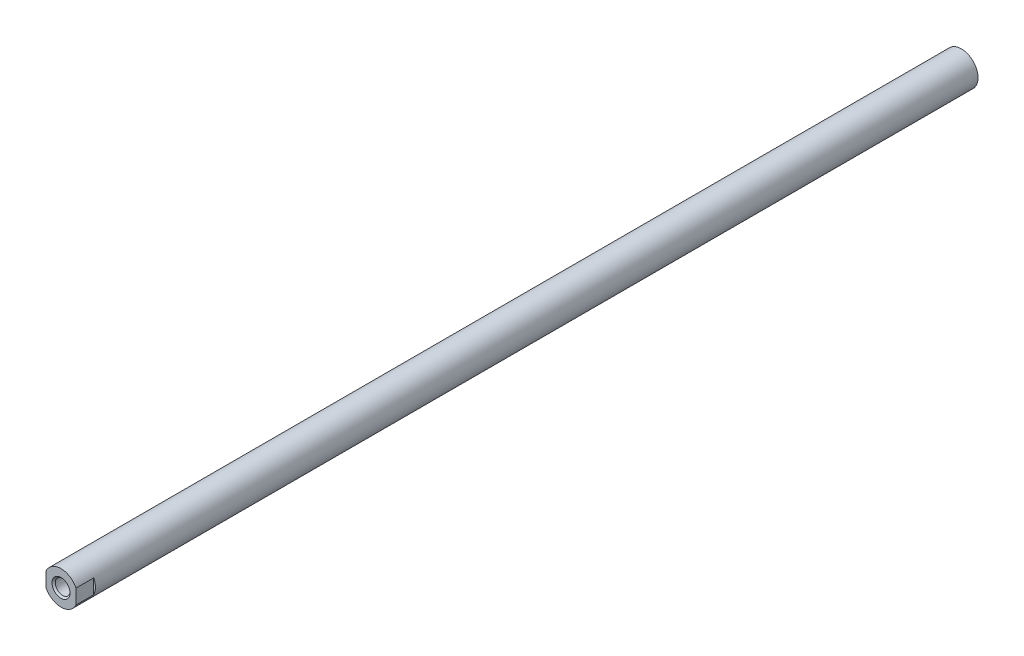
ISO-10303-21;
HEADER;
FILE_DESCRIPTION(('STEP AP214'),'2;1');
FILE_NAME('part.step','',(''),(''),'','','');
FILE_SCHEMA(('AUTOMOTIVE_DESIGN { 1 0 10303 214 1 1 1 1 }'));
ENDSEC;
DATA;
#1=APPLICATION_CONTEXT('core data for automotive mechanical design processes');
#2=APPLICATION_PROTOCOL_DEFINITION('international standard','automotive_design',2000,#1);
#3=PRODUCT_CONTEXT('',#1,'mechanical');
#4=PRODUCT('Part','Part','',(#3));
#5=PRODUCT_RELATED_PRODUCT_CATEGORY('part','',(#4));
#6=PRODUCT_DEFINITION_FORMATION('','',#4);
#7=PRODUCT_DEFINITION_CONTEXT('part definition',#1,'design');
#8=PRODUCT_DEFINITION('design','',#6,#7);
#9=PRODUCT_DEFINITION_SHAPE('','',#8);
#10=(LENGTH_UNIT() NAMED_UNIT(*) SI_UNIT(.MILLI.,.METRE.));
#11=(NAMED_UNIT(*) PLANE_ANGLE_UNIT() SI_UNIT($,.RADIAN.));
#12=(NAMED_UNIT(*) SI_UNIT($,.STERADIAN.) SOLID_ANGLE_UNIT());
#13=UNCERTAINTY_MEASURE_WITH_UNIT(LENGTH_MEASURE(1.E-05),#10,'distance_accuracy_value','');
#14=(GEOMETRIC_REPRESENTATION_CONTEXT(3) GLOBAL_UNCERTAINTY_ASSIGNED_CONTEXT((#13)) GLOBAL_UNIT_ASSIGNED_CONTEXT((#10,
#11,#12)) REPRESENTATION_CONTEXT('',''));
#15=CARTESIAN_POINT('',(0.,0.,0.));
#16=DIRECTION('',(0.,0.,1.));
#17=DIRECTION('',(1.,0.,0.));
#18=AXIS2_PLACEMENT_3D('',#15,#16,#17);
#19=CARTESIAN_POINT('',(0.,0.,5.56443494635243));
#20=DIRECTION('',(0.,0.,-1.));
#21=DIRECTION('',(-1.,0.,0.));
#22=AXIS2_PLACEMENT_3D('',#19,#20,#21);
#23=CYLINDRICAL_SURFACE('',#22,5.56443494635243);
#24=DIRECTION('',(0.,0.,-1.));
#25=VECTOR('',#24,1.);
#26=CARTESIAN_POINT('',(5.,2.44191242107251,5.56443494635243));
#27=LINE('',#26,#25);
#28=CARTESIAN_POINT('',(5.,2.44191242107251,-0.335565053647566));
#29=VERTEX_POINT('',#28);
#30=CARTESIAN_POINT('',(5.,2.44191242107251,5.56443494635243));
#31=VERTEX_POINT('',#30);
#32=EDGE_CURVE('E57',#29,#31,#27,.F.);
#33=ORIENTED_EDGE('',*,*,#32,.F.);
#34=CARTESIAN_POINT('',(0.,0.,-0.335565053647566));
#35=DIRECTION('',(0.,0.,1.));
#36=DIRECTION('',(1.,0.,0.));
#37=AXIS2_PLACEMENT_3D('',#34,#35,#36);
#38=CIRCLE('',#37,5.56443494635243);
#39=CARTESIAN_POINT('',(5.,-2.44191242107251,-0.335565053647566));
#40=VERTEX_POINT('',#39);
#41=EDGE_CURVE('E125',#29,#40,#38,.F.);
#42=ORIENTED_EDGE('',*,*,#41,.T.);
#43=DIRECTION('',(0.,0.,-1.));
#44=VECTOR('',#43,1.);
#45=CARTESIAN_POINT('',(5.,-2.44191242107251,5.56443494635243));
#46=LINE('',#45,#44);
#47=CARTESIAN_POINT('',(5.,-2.44191242107251,5.56443494635243));
#48=VERTEX_POINT('',#47);
#49=EDGE_CURVE('E100',#48,#40,#46,.T.);
#50=ORIENTED_EDGE('',*,*,#49,.F.);
#51=CARTESIAN_POINT('',(0.,0.,5.56443494635243));
#52=DIRECTION('',(0.,0.,-1.));
#53=DIRECTION('',(-1.,0.,0.));
#54=AXIS2_PLACEMENT_3D('',#51,#52,#53);
#55=CIRCLE('',#54,5.56443494635243);
#56=CARTESIAN_POINT('',(-5.,-2.44191242107251,5.56443494635243));
#57=VERTEX_POINT('',#56);
#58=EDGE_CURVE('E65',#48,#57,#55,.T.);
#59=ORIENTED_EDGE('',*,*,#58,.T.);
#60=DIRECTION('',(0.,0.,-1.));
#61=VECTOR('',#60,1.);
#62=CARTESIAN_POINT('',(-5.,-2.44191242107251,5.56443494635243));
#63=LINE('',#62,#61);
#64=CARTESIAN_POINT('',(-5.,-2.44191242107251,-0.335565053647566));
#65=VERTEX_POINT('',#64);
#66=EDGE_CURVE('E110',#65,#57,#63,.F.);
#67=ORIENTED_EDGE('',*,*,#66,.F.);
#68=CARTESIAN_POINT('',(0.,0.,-0.335565053647566));
#69=DIRECTION('',(0.,0.,1.));
#70=DIRECTION('',(1.,0.,0.));
#71=AXIS2_PLACEMENT_3D('',#68,#69,#70);
#72=CIRCLE('',#71,5.56443494635243);
#73=CARTESIAN_POINT('',(-5.,2.44191242107251,-0.335565053647566));
#74=VERTEX_POINT('',#73);
#75=EDGE_CURVE('E120',#65,#74,#72,.F.);
#76=ORIENTED_EDGE('',*,*,#75,.T.);
#77=DIRECTION('',(0.,0.,-1.));
#78=VECTOR('',#77,1.);
#79=CARTESIAN_POINT('',(-5.,2.44191242107251,5.56443494635243));
#80=LINE('',#79,#78);
#81=CARTESIAN_POINT('',(-5.,2.44191242107251,5.56443494635243));
#82=VERTEX_POINT('',#81);
#83=EDGE_CURVE('E108',#82,#74,#80,.T.);
#84=ORIENTED_EDGE('',*,*,#83,.F.);
#85=EDGE_CURVE('E115',#82,#31,#55,.T.);
#86=ORIENTED_EDGE('',*,*,#85,.T.);
#87=EDGE_LOOP('',(#33,#42,#50,#59,#67,#76,#84,#86));
#88=FACE_BOUND('',#87,.T.);
#89=CARTESIAN_POINT('',(0.,0.,-294.435565053648));
#90=DIRECTION('',(0.,0.,-1.));
#91=DIRECTION('',(-1.,0.,0.));
#92=AXIS2_PLACEMENT_3D('',#89,#90,#91);
#93=CIRCLE('',#92,5.56443494635243);
#94=CARTESIAN_POINT('',(-5.56443494635243,0.,-294.435565053648));
#95=VERTEX_POINT('',#94);
#96=EDGE_CURVE('E112',#95,#95,#93,.T.);
#97=ORIENTED_EDGE('',*,*,#96,.F.);
#98=EDGE_LOOP('',(#97));
#99=FACE_BOUND('',#98,.T.);
#100=ADVANCED_FACE('F41',(#88,#99),#23,.T.);
#101=CARTESIAN_POINT('',(5.56443494635243,0.,5.56443494635243));
#102=DIRECTION('',(0.,0.,1.));
#103=DIRECTION('',(1.,0.,0.));
#104=AXIS2_PLACEMENT_3D('',#101,#102,#103);
#105=PLANE('',#104);
#106=CARTESIAN_POINT('',(0.,0.,5.56443494635243));
#107=DIRECTION('',(0.,0.,1.));
#108=DIRECTION('',(1.,0.,0.));
#109=AXIS2_PLACEMENT_3D('',#106,#107,#108);
#110=CIRCLE('',#109,2.99999999999998);
#111=CARTESIAN_POINT('',(2.99999999999998,0.,5.56443494635243));
#112=VERTEX_POINT('',#111);
#113=EDGE_CURVE('E11',#112,#112,#110,.F.);
#114=ORIENTED_EDGE('',*,*,#113,.T.);
#115=EDGE_LOOP('',(#114));
#116=FACE_BOUND('',#115,.T.);
#117=DIRECTION('',(0.,-1.,0.));
#118=VECTOR('',#117,1.);
#119=CARTESIAN_POINT('',(5.,0.,5.56443494635243));
#120=LINE('',#119,#118);
#121=EDGE_CURVE('E123',#31,#48,#120,.T.);
#122=ORIENTED_EDGE('',*,*,#121,.F.);
#123=ORIENTED_EDGE('',*,*,#85,.F.);
#124=DIRECTION('',(0.,1.,0.));
#125=VECTOR('',#124,1.);
#126=CARTESIAN_POINT('',(-5.,0.,5.56443494635243));
#127=LINE('',#126,#125);
#128=EDGE_CURVE('E118',#57,#82,#127,.T.);
#129=ORIENTED_EDGE('',*,*,#128,.F.);
#130=ORIENTED_EDGE('',*,*,#58,.F.);
#131=EDGE_LOOP('',(#122,#123,#129,#130));
#132=FACE_BOUND('',#131,.T.);
#133=ADVANCED_FACE('F139',(#116,#132),#105,.T.);
#134=CARTESIAN_POINT('',(0.,0.,-294.435565053648));
#135=DIRECTION('',(0.,0.,-1.));
#136=DIRECTION('',(-1.,0.,0.));
#137=AXIS2_PLACEMENT_3D('',#134,#135,#136);
#138=PLANE('',#137);
#139=ORIENTED_EDGE('',*,*,#96,.T.);
#140=EDGE_LOOP('',(#139));
#141=FACE_BOUND('',#140,.T.);
#142=ADVANCED_FACE('F143',(#141),#138,.T.);
#143=CARTESIAN_POINT('',(-5.,-3.3166247903554,-0.335565053647566));
#144=DIRECTION('',(1.,0.,0.));
#145=DIRECTION('',(0.,0.,-1.));
#146=AXIS2_PLACEMENT_3D('',#143,#144,#145);
#147=PLANE('',#146);
#148=ORIENTED_EDGE('',*,*,#66,.T.);
#149=ORIENTED_EDGE('',*,*,#128,.T.);
#150=ORIENTED_EDGE('',*,*,#83,.T.);
#151=DIRECTION('',(0.,1.,0.));
#152=VECTOR('',#151,1.);
#153=CARTESIAN_POINT('',(-5.,-3.3166247903554,-0.335565053647566));
#154=LINE('',#153,#152);
#155=EDGE_CURVE('E105',#65,#74,#154,.T.);
#156=ORIENTED_EDGE('',*,*,#155,.F.);
#157=EDGE_LOOP('',(#148,#149,#150,#156));
#158=FACE_BOUND('',#157,.T.);
#159=ADVANCED_FACE('F150',(#158),#147,.F.);
#160=CARTESIAN_POINT('',(0.,0.,-0.335565053647566));
#161=DIRECTION('',(0.,0.,1.));
#162=DIRECTION('',(1.,0.,0.));
#163=AXIS2_PLACEMENT_3D('',#160,#161,#162);
#164=PLANE('',#163);
#165=ORIENTED_EDGE('',*,*,#155,.T.);
#166=ORIENTED_EDGE('',*,*,#75,.F.);
#167=EDGE_LOOP('',(#165,#166));
#168=FACE_BOUND('',#167,.T.);
#169=ADVANCED_FACE('F154',(#168),#164,.T.);
#170=CARTESIAN_POINT('',(5.,3.3166247903554,-0.335565053647566));
#171=DIRECTION('',(-1.,0.,0.));
#172=DIRECTION('',(0.,0.,1.));
#173=AXIS2_PLACEMENT_3D('',#170,#171,#172);
#174=PLANE('',#173);
#175=ORIENTED_EDGE('',*,*,#32,.T.);
#176=ORIENTED_EDGE('',*,*,#121,.T.);
#177=ORIENTED_EDGE('',*,*,#49,.T.);
#178=DIRECTION('',(0.,-1.,0.));
#179=VECTOR('',#178,1.);
#180=CARTESIAN_POINT('',(5.,3.3166247903554,-0.335565053647566));
#181=LINE('',#180,#179);
#182=EDGE_CURVE('E97',#29,#40,#181,.T.);
#183=ORIENTED_EDGE('',*,*,#182,.F.);
#184=EDGE_LOOP('',(#175,#176,#177,#183));
#185=FACE_BOUND('',#184,.T.);
#186=ADVANCED_FACE('F158',(#185),#174,.F.);
#187=CARTESIAN_POINT('',(0.,0.,-0.335565053647566));
#188=DIRECTION('',(0.,0.,1.));
#189=DIRECTION('',(1.,0.,0.));
#190=AXIS2_PLACEMENT_3D('',#187,#188,#189);
#191=PLANE('',#190);
#192=ORIENTED_EDGE('',*,*,#182,.T.);
#193=ORIENTED_EDGE('',*,*,#41,.F.);
#194=EDGE_LOOP('',(#192,#193));
#195=FACE_BOUND('',#194,.T.);
#196=ADVANCED_FACE('F91',(#195),#191,.T.);
#197=CARTESIAN_POINT('',(0.,0.,-4.93556505364756));
#198=DIRECTION('',(0.,0.,1.));
#199=DIRECTION('',(1.,0.,0.));
#200=AXIS2_PLACEMENT_3D('',#197,#198,#199);
#201=CONICAL_SURFACE('',#200,2.46,1.0471975511966);
#202=CARTESIAN_POINT('',(0.,0.,-6.35584671585404));
#203=VERTEX_POINT('',#202);
#204=VERTEX_LOOP('',#203);
#205=FACE_BOUND('',#204,.T.);
#206=CARTESIAN_POINT('',(0.,0.,-4.93556505364756));
#207=DIRECTION('',(0.,0.,1.));
#208=DIRECTION('',(1.,0.,0.));
#209=AXIS2_PLACEMENT_3D('',#206,#207,#208);
#210=CIRCLE('',#209,2.46);
#211=CARTESIAN_POINT('',(2.46,0.,-4.93556505364756));
#212=VERTEX_POINT('',#211);
#213=EDGE_CURVE('E95',#212,#212,#210,.T.);
#214=ORIENTED_EDGE('',*,*,#213,.T.);
#215=EDGE_LOOP('',(#214));
#216=FACE_BOUND('',#215,.T.);
#217=ADVANCED_FACE('F87',(#205,#216),#201,.F.);
#218=CARTESIAN_POINT('',(0.,0.,5.56443494635243));
#219=DIRECTION('',(0.,0.,1.));
#220=DIRECTION('',(1.,0.,0.));
#221=AXIS2_PLACEMENT_3D('',#218,#219,#220);
#222=CYLINDRICAL_SURFACE('',#221,2.46);
#223=CARTESIAN_POINT('',(0.,0.,5.02443494635245));
#224=DIRECTION('',(0.,0.,1.));
#225=DIRECTION('',(1.,0.,0.));
#226=AXIS2_PLACEMENT_3D('',#223,#224,#225);
#227=CIRCLE('',#226,2.46);
#228=CARTESIAN_POINT('',(2.46,0.,5.02443494635245));
#229=VERTEX_POINT('',#228);
#230=EDGE_CURVE('E50',#229,#229,#227,.T.);
#231=ORIENTED_EDGE('',*,*,#230,.T.);
#232=EDGE_LOOP('',(#231));
#233=FACE_BOUND('',#232,.T.);
#234=ORIENTED_EDGE('',*,*,#213,.F.);
#235=EDGE_LOOP('',(#234));
#236=FACE_BOUND('',#235,.T.);
#237=ADVANCED_FACE('F90',(#233,#236),#222,.F.);
#238=CARTESIAN_POINT('',(0.,0.,5.02443494635245));
#239=DIRECTION('',(0.,0.,1.));
#240=DIRECTION('',(1.,0.,0.));
#241=AXIS2_PLACEMENT_3D('',#238,#239,#240);
#242=CONICAL_SURFACE('',#241,2.46,0.785398163397443);
#243=ORIENTED_EDGE('',*,*,#113,.F.);
#244=EDGE_LOOP('',(#243));
#245=FACE_BOUND('',#244,.T.);
#246=ORIENTED_EDGE('',*,*,#230,.F.);
#247=EDGE_LOOP('',(#246));
#248=FACE_BOUND('',#247,.T.);
#249=ADVANCED_FACE('F44',(#245,#248),#242,.F.);
#250=CLOSED_SHELL('',(#100,#133,#142,#159,#169,#186,#196,#217,#237,#249));
#251=MANIFOLD_SOLID_BREP('B2',#250);
#252=ADVANCED_BREP_SHAPE_REPRESENTATION('',(#18,#251),#14);
#253=SHAPE_DEFINITION_REPRESENTATION(#9,#252);
ENDSEC;
END-ISO-10303-21;
